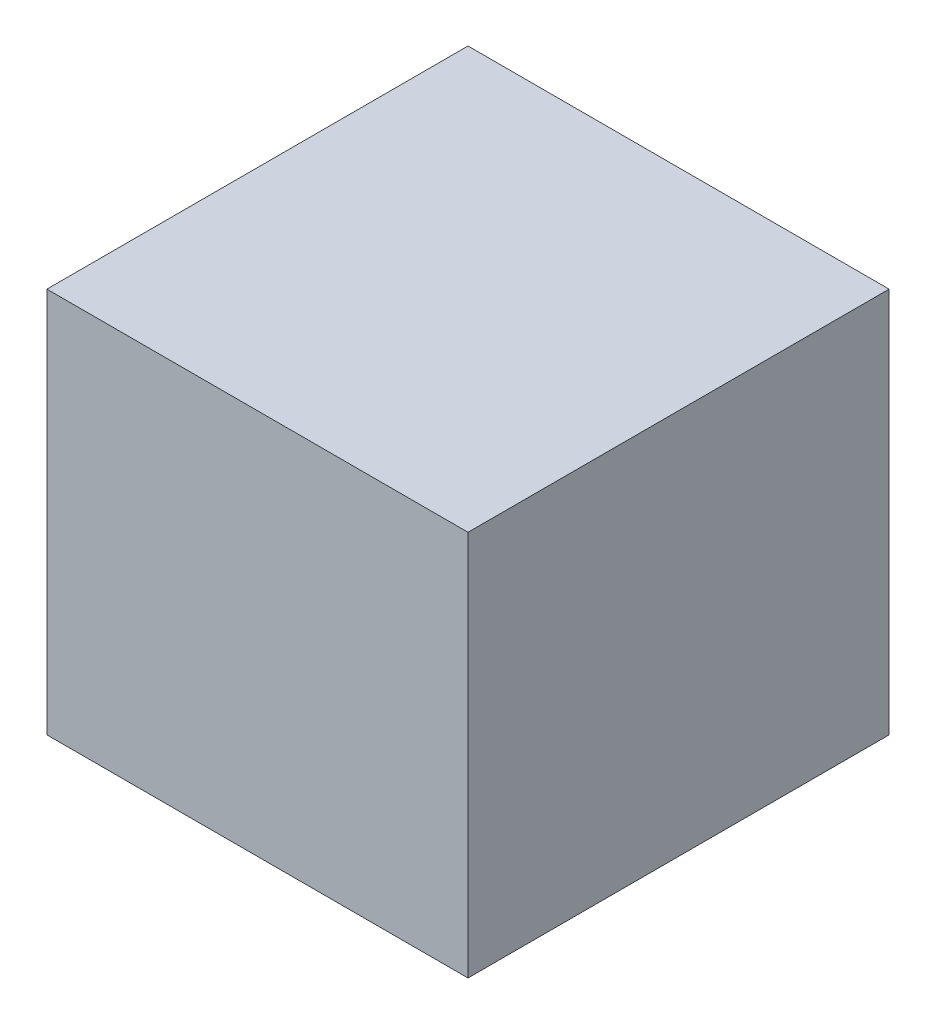
ISO-10303-21;
HEADER;
FILE_DESCRIPTION(('STEP AP214'),'2;1');
FILE_NAME('part.step','',(''),(''),'','','');
FILE_SCHEMA(('AUTOMOTIVE_DESIGN { 1 0 10303 214 1 1 1 1 }'));
ENDSEC;
DATA;
#1=APPLICATION_CONTEXT('core data for automotive mechanical design processes');
#2=APPLICATION_PROTOCOL_DEFINITION('international standard','automotive_design',2000,#1);
#3=PRODUCT_CONTEXT('',#1,'mechanical');
#4=PRODUCT('Part','Part','',(#3));
#5=PRODUCT_RELATED_PRODUCT_CATEGORY('part','',(#4));
#6=PRODUCT_DEFINITION_FORMATION('','',#4);
#7=PRODUCT_DEFINITION_CONTEXT('part definition',#1,'design');
#8=PRODUCT_DEFINITION('design','',#6,#7);
#9=PRODUCT_DEFINITION_SHAPE('','',#8);
#10=(LENGTH_UNIT() NAMED_UNIT(*) SI_UNIT(.MILLI.,.METRE.));
#11=(NAMED_UNIT(*) PLANE_ANGLE_UNIT() SI_UNIT($,.RADIAN.));
#12=(NAMED_UNIT(*) SI_UNIT($,.STERADIAN.) SOLID_ANGLE_UNIT());
#13=UNCERTAINTY_MEASURE_WITH_UNIT(LENGTH_MEASURE(1.E-05),#10,'distance_accuracy_value','');
#14=(GEOMETRIC_REPRESENTATION_CONTEXT(3) GLOBAL_UNCERTAINTY_ASSIGNED_CONTEXT((#13)) GLOBAL_UNIT_ASSIGNED_CONTEXT((#10,
#11,#12)) REPRESENTATION_CONTEXT('',''));
#15=CARTESIAN_POINT('',(0.,0.,0.));
#16=DIRECTION('',(0.,0.,1.));
#17=DIRECTION('',(1.,0.,0.));
#18=AXIS2_PLACEMENT_3D('',#15,#16,#17);
#19=CARTESIAN_POINT('',(0.,76.2,0.));
#20=DIRECTION('',(0.,1.,0.));
#21=DIRECTION('',(0.,0.,1.));
#22=AXIS2_PLACEMENT_3D('',#19,#20,#21);
#23=PLANE('',#22);
#24=CARTESIAN_POINT('',(0.,76.2,0.));
#25=DIRECTION('',(0.,1.,0.));
#26=DIRECTION('',(0.,0.,1.));
#27=AXIS2_PLACEMENT_3D('',#24,#25,#26);
#28=CIRCLE('',#27,10.16);
#29=CARTESIAN_POINT('',(0.,76.2,10.16));
#30=VERTEX_POINT('',#29);
#31=EDGE_CURVE('E176',#30,#30,#28,.T.);
#32=ORIENTED_EDGE('',*,*,#31,.F.);
#33=EDGE_LOOP('',(#32));
#34=FACE_BOUND('',#33,.T.);
#35=ADVANCED_FACE('F39',(#34),#23,.F.);
#36=CARTESIAN_POINT('',(13.208,83.82,0.));
#37=DIRECTION('',(0.,-1.,0.));
#38=DIRECTION('',(0.,0.,-1.));
#39=AXIS2_PLACEMENT_3D('',#36,#37,#38);
#40=PLANE('',#39);
#41=DIRECTION('',(0.,0.,-1.));
#42=VECTOR('',#41,1.);
#43=CARTESIAN_POINT('',(45.72,83.82,45.72));
#44=LINE('',#43,#42);
#45=CARTESIAN_POINT('',(45.72,83.82,45.72));
#46=VERTEX_POINT('',#45);
#47=CARTESIAN_POINT('',(45.72,83.82,-45.72));
#48=VERTEX_POINT('',#47);
#49=EDGE_CURVE('E47',#46,#48,#44,.T.);
#50=ORIENTED_EDGE('',*,*,#49,.T.);
#51=DIRECTION('',(-1.,0.,0.));
#52=VECTOR('',#51,1.);
#53=CARTESIAN_POINT('',(-45.72,83.82,-45.72));
#54=LINE('',#53,#52);
#55=CARTESIAN_POINT('',(-45.72,83.82,-45.72));
#56=VERTEX_POINT('',#55);
#57=EDGE_CURVE('E53',#48,#56,#54,.T.);
#58=ORIENTED_EDGE('',*,*,#57,.T.);
#59=DIRECTION('',(0.,0.,1.));
#60=VECTOR('',#59,1.);
#61=CARTESIAN_POINT('',(-45.72,83.82,45.72));
#62=LINE('',#61,#60);
#63=CARTESIAN_POINT('',(-45.72,83.8200000000001,45.72));
#64=VERTEX_POINT('',#63);
#65=EDGE_CURVE('E109',#56,#64,#62,.T.);
#66=ORIENTED_EDGE('',*,*,#65,.T.);
#67=DIRECTION('',(1.,0.,0.));
#68=VECTOR('',#67,1.);
#69=CARTESIAN_POINT('',(-45.72,83.82,45.72));
#70=LINE('',#69,#68);
#71=EDGE_CURVE('E11',#64,#46,#70,.T.);
#72=ORIENTED_EDGE('',*,*,#71,.T.);
#73=EDGE_LOOP('',(#50,#58,#66,#72));
#74=FACE_BOUND('',#73,.T.);
#75=ADVANCED_FACE('F187',(#74),#40,.F.);
#76=CARTESIAN_POINT('',(-45.72,220.755688143396,-45.72));
#77=DIRECTION('',(0.,0.,-1.));
#78=DIRECTION('',(-1.,0.,0.));
#79=AXIS2_PLACEMENT_3D('',#76,#77,#78);
#80=PLANE('',#79);
#81=ORIENTED_EDGE('',*,*,#57,.F.);
#82=DIRECTION('',(0.,-1.,0.));
#83=VECTOR('',#82,1.);
#84=CARTESIAN_POINT('',(45.72,220.755688143396,-45.72));
#85=LINE('',#84,#83);
#86=CARTESIAN_POINT('',(45.72,0.,-45.72));
#87=VERTEX_POINT('',#86);
#88=EDGE_CURVE('E107',#48,#87,#85,.T.);
#89=ORIENTED_EDGE('',*,*,#88,.T.);
#90=DIRECTION('',(1.,0.,0.));
#91=VECTOR('',#90,1.);
#92=CARTESIAN_POINT('',(-45.72,0.,-45.72));
#93=LINE('',#92,#91);
#94=CARTESIAN_POINT('',(-45.72,0.,-45.72));
#95=VERTEX_POINT('',#94);
#96=EDGE_CURVE('E85',#95,#87,#93,.T.);
#97=ORIENTED_EDGE('',*,*,#96,.F.);
#98=DIRECTION('',(0.,-1.,0.));
#99=VECTOR('',#98,1.);
#100=CARTESIAN_POINT('',(-45.72,220.755688143396,-45.72));
#101=LINE('',#100,#99);
#102=EDGE_CURVE('E110',#56,#95,#101,.T.);
#103=ORIENTED_EDGE('',*,*,#102,.F.);
#104=EDGE_LOOP('',(#81,#89,#97,#103));
#105=FACE_BOUND('',#104,.T.);
#106=ADVANCED_FACE('F116',(#105),#80,.T.);
#107=CARTESIAN_POINT('',(-45.72,220.755688143396,45.72));
#108=DIRECTION('',(-1.,0.,0.));
#109=DIRECTION('',(0.,0.,1.));
#110=AXIS2_PLACEMENT_3D('',#107,#108,#109);
#111=PLANE('',#110);
#112=ORIENTED_EDGE('',*,*,#65,.F.);
#113=ORIENTED_EDGE('',*,*,#102,.T.);
#114=DIRECTION('',(0.,0.,-1.));
#115=VECTOR('',#114,1.);
#116=CARTESIAN_POINT('',(-45.72,0.,45.72));
#117=LINE('',#116,#115);
#118=CARTESIAN_POINT('',(-45.72,0.,45.72));
#119=VERTEX_POINT('',#118);
#120=EDGE_CURVE('E93',#119,#95,#117,.T.);
#121=ORIENTED_EDGE('',*,*,#120,.F.);
#122=DIRECTION('',(0.,-1.,0.));
#123=VECTOR('',#122,1.);
#124=CARTESIAN_POINT('',(-45.72,220.755688143396,45.72));
#125=LINE('',#124,#123);
#126=EDGE_CURVE('E84',#64,#119,#125,.T.);
#127=ORIENTED_EDGE('',*,*,#126,.F.);
#128=EDGE_LOOP('',(#112,#113,#121,#127));
#129=FACE_BOUND('',#128,.T.);
#130=ADVANCED_FACE('F114',(#129),#111,.T.);
#131=CARTESIAN_POINT('',(-45.72,220.755688143396,45.72));
#132=DIRECTION('',(0.,0.,1.));
#133=DIRECTION('',(1.,0.,0.));
#134=AXIS2_PLACEMENT_3D('',#131,#132,#133);
#135=PLANE('',#134);
#136=ORIENTED_EDGE('',*,*,#71,.F.);
#137=ORIENTED_EDGE('',*,*,#126,.T.);
#138=DIRECTION('',(-1.,0.,0.));
#139=VECTOR('',#138,1.);
#140=CARTESIAN_POINT('',(-45.72,0.,45.72));
#141=LINE('',#140,#139);
#142=CARTESIAN_POINT('',(45.72,0.,45.72));
#143=VERTEX_POINT('',#142);
#144=EDGE_CURVE('E87',#143,#119,#141,.T.);
#145=ORIENTED_EDGE('',*,*,#144,.F.);
#146=DIRECTION('',(0.,-1.,0.));
#147=VECTOR('',#146,1.);
#148=CARTESIAN_POINT('',(45.72,220.755688143396,45.72));
#149=LINE('',#148,#147);
#150=EDGE_CURVE('E75',#46,#143,#149,.T.);
#151=ORIENTED_EDGE('',*,*,#150,.F.);
#152=EDGE_LOOP('',(#136,#137,#145,#151));
#153=FACE_BOUND('',#152,.T.);
#154=ADVANCED_FACE('F88',(#153),#135,.T.);
#155=CARTESIAN_POINT('',(45.72,220.755688143396,45.72));
#156=DIRECTION('',(1.,0.,0.));
#157=DIRECTION('',(0.,0.,-1.));
#158=AXIS2_PLACEMENT_3D('',#155,#156,#157);
#159=PLANE('',#158);
#160=ORIENTED_EDGE('',*,*,#49,.F.);
#161=ORIENTED_EDGE('',*,*,#150,.T.);
#162=DIRECTION('',(0.,0.,1.));
#163=VECTOR('',#162,1.);
#164=CARTESIAN_POINT('',(45.72,0.,45.72));
#165=LINE('',#164,#163);
#166=EDGE_CURVE('E80',#87,#143,#165,.T.);
#167=ORIENTED_EDGE('',*,*,#166,.F.);
#168=ORIENTED_EDGE('',*,*,#88,.F.);
#169=EDGE_LOOP('',(#160,#161,#167,#168));
#170=FACE_BOUND('',#169,.T.);
#171=ADVANCED_FACE('F77',(#170),#159,.T.);
#172=CARTESIAN_POINT('',(0.,0.,0.));
#173=DIRECTION('',(0.,-1.,0.));
#174=DIRECTION('',(0.,0.,-1.));
#175=AXIS2_PLACEMENT_3D('',#172,#173,#174);
#176=PLANE('',#175);
#177=CARTESIAN_POINT('',(0.,0.,0.));
#178=DIRECTION('',(0.,1.,0.));
#179=DIRECTION('',(0.,0.,1.));
#180=AXIS2_PLACEMENT_3D('',#177,#178,#179);
#181=CIRCLE('',#180,35.56);
#182=CARTESIAN_POINT('',(0.,0.,35.56));
#183=VERTEX_POINT('',#182);
#184=EDGE_CURVE('E145',#183,#183,#181,.F.);
#185=ORIENTED_EDGE('',*,*,#184,.F.);
#186=EDGE_LOOP('',(#185));
#187=FACE_BOUND('',#186,.T.);
#188=ORIENTED_EDGE('',*,*,#166,.T.);
#189=ORIENTED_EDGE('',*,*,#144,.T.);
#190=ORIENTED_EDGE('',*,*,#120,.T.);
#191=ORIENTED_EDGE('',*,*,#96,.T.);
#192=EDGE_LOOP('',(#188,#189,#190,#191));
#193=FACE_BOUND('',#192,.T.);
#194=ADVANCED_FACE('F95',(#187,#193),#176,.T.);
#195=CARTESIAN_POINT('',(0.,60.6579363383213,0.));
#196=DIRECTION('',(0.,1.,0.));
#197=DIRECTION('',(0.,0.,1.));
#198=AXIS2_PLACEMENT_3D('',#195,#196,#197);
#199=TOROIDAL_SURFACE('',#198,23.368,10.16);
#200=CARTESIAN_POINT('',(0.,60.6579363383213,0.));
#201=DIRECTION('',(0.,1.,0.));
#202=DIRECTION('',(0.,0.,1.));
#203=AXIS2_PLACEMENT_3D('',#200,#201,#202);
#204=CIRCLE('',#203,13.208);
#205=CARTESIAN_POINT('',(0.,60.6579363383213,13.208));
#206=VERTEX_POINT('',#205);
#207=EDGE_CURVE('E167',#206,#206,#204,.T.);
#208=ORIENTED_EDGE('',*,*,#207,.T.);
#209=EDGE_LOOP('',(#208));
#210=FACE_BOUND('',#209,.T.);
#211=CARTESIAN_POINT('',(0.,54.3893477857335,0.));
#212=DIRECTION('',(0.,1.,0.));
#213=DIRECTION('',(0.,0.,1.));
#214=AXIS2_PLACEMENT_3D('',#211,#212,#213);
#215=CIRCLE('',#214,15.372351335985);
#216=CARTESIAN_POINT('',(0.,54.3893477857335,15.372351335985));
#217=VERTEX_POINT('',#216);
#218=EDGE_CURVE('E164',#217,#217,#215,.T.);
#219=ORIENTED_EDGE('',*,*,#218,.F.);
#220=EDGE_LOOP('',(#219));
#221=FACE_BOUND('',#220,.T.);
#222=ADVANCED_FACE('F194',(#210,#221),#199,.T.);
#223=CARTESIAN_POINT('',(0.,76.2,0.));
#224=DIRECTION('',(0.,1.,0.));
#225=DIRECTION('',(0.,0.,1.));
#226=AXIS2_PLACEMENT_3D('',#223,#224,#225);
#227=CYLINDRICAL_SURFACE('',#226,13.208);
#228=CARTESIAN_POINT('',(0.,64.2062181691606,0.));
#229=DIRECTION('',(0.,-1.,0.));
#230=DIRECTION('',(0.,0.,-1.));
#231=AXIS2_PLACEMENT_3D('',#228,#229,#230);
#232=CIRCLE('',#231,13.208);
#233=CARTESIAN_POINT('',(0.,64.2062181691606,-13.208));
#234=VERTEX_POINT('',#233);
#235=EDGE_CURVE('E127',#234,#234,#232,.T.);
#236=ORIENTED_EDGE('',*,*,#235,.F.);
#237=EDGE_LOOP('',(#236));
#238=FACE_BOUND('',#237,.T.);
#239=ORIENTED_EDGE('',*,*,#207,.F.);
#240=EDGE_LOOP('',(#239));
#241=FACE_BOUND('',#240,.T.);
#242=ADVANCED_FACE('F201',(#238,#241),#227,.F.);
#243=CARTESIAN_POINT('',(0.,64.2062181691606,0.));
#244=DIRECTION('',(0.,-1.,0.));
#245=DIRECTION('',(0.,0.,-1.));
#246=AXIS2_PLACEMENT_3D('',#243,#244,#245);
#247=TOROIDAL_SURFACE('',#246,12.954,0.254);
#248=ORIENTED_EDGE('',*,*,#235,.T.);
#249=EDGE_LOOP('',(#248));
#250=FACE_BOUND('',#249,.T.);
#251=CARTESIAN_POINT('',(0.,64.4602181691606,0.));
#252=DIRECTION('',(0.,-1.,0.));
#253=DIRECTION('',(0.,0.,-1.));
#254=AXIS2_PLACEMENT_3D('',#251,#252,#253);
#255=CIRCLE('',#254,12.954);
#256=CARTESIAN_POINT('',(0.,64.4602181691606,-12.954));
#257=VERTEX_POINT('',#256);
#258=EDGE_CURVE('E130',#257,#257,#255,.F.);
#259=ORIENTED_EDGE('',*,*,#258,.T.);
#260=EDGE_LOOP('',(#259));
#261=FACE_BOUND('',#260,.T.);
#262=ADVANCED_FACE('F248',(#250,#261),#247,.F.);
#263=CARTESIAN_POINT('',(12.446,64.4602181691606,0.));
#264=DIRECTION('',(0.,-1.,0.));
#265=DIRECTION('',(0.,0.,-1.));
#266=AXIS2_PLACEMENT_3D('',#263,#264,#265);
#267=PLANE('',#266);
#268=ORIENTED_EDGE('',*,*,#258,.F.);
#269=EDGE_LOOP('',(#268));
#270=FACE_BOUND('',#269,.T.);
#271=CARTESIAN_POINT('',(0.,64.4602181691606,0.));
#272=DIRECTION('',(0.,1.,0.));
#273=DIRECTION('',(0.,0.,1.));
#274=AXIS2_PLACEMENT_3D('',#271,#272,#273);
#275=CIRCLE('',#274,12.446);
#276=CARTESIAN_POINT('',(0.,64.4602181691606,12.446));
#277=VERTEX_POINT('',#276);
#278=EDGE_CURVE('E170',#277,#277,#275,.T.);
#279=ORIENTED_EDGE('',*,*,#278,.T.);
#280=EDGE_LOOP('',(#279));
#281=FACE_BOUND('',#280,.T.);
#282=ADVANCED_FACE('F261',(#270,#281),#267,.T.);
#283=CARTESIAN_POINT('',(0.,76.2,0.));
#284=DIRECTION('',(0.,1.,0.));
#285=DIRECTION('',(0.,0.,1.));
#286=AXIS2_PLACEMENT_3D('',#283,#284,#285);
#287=CYLINDRICAL_SURFACE('',#286,12.446);
#288=CARTESIAN_POINT('',(0.,72.3977181691606,0.));
#289=DIRECTION('',(0.,1.,0.));
#290=DIRECTION('',(0.,0.,1.));
#291=AXIS2_PLACEMENT_3D('',#288,#289,#290);
#292=CIRCLE('',#291,12.446);
#293=CARTESIAN_POINT('',(0.,72.3977181691606,12.446));
#294=VERTEX_POINT('',#293);
#295=EDGE_CURVE('E173',#294,#294,#292,.T.);
#296=ORIENTED_EDGE('',*,*,#295,.T.);
#297=EDGE_LOOP('',(#296));
#298=FACE_BOUND('',#297,.T.);
#299=ORIENTED_EDGE('',*,*,#278,.F.);
#300=EDGE_LOOP('',(#299));
#301=FACE_BOUND('',#300,.T.);
#302=ADVANCED_FACE('F274',(#298,#301),#287,.F.);
#303=CARTESIAN_POINT('',(13.208,72.3977181691606,0.));
#304=DIRECTION('',(0.,1.,0.));
#305=DIRECTION('',(0.,0.,1.));
#306=AXIS2_PLACEMENT_3D('',#303,#304,#305);
#307=PLANE('',#306);
#308=CARTESIAN_POINT('',(0.,72.3977181691606,0.));
#309=DIRECTION('',(0.,1.,0.));
#310=DIRECTION('',(0.,0.,1.));
#311=AXIS2_PLACEMENT_3D('',#308,#309,#310);
#312=CIRCLE('',#311,12.954);
#313=CARTESIAN_POINT('',(0.,72.3977181691606,12.954));
#314=VERTEX_POINT('',#313);
#315=EDGE_CURVE('E133',#314,#314,#312,.F.);
#316=ORIENTED_EDGE('',*,*,#315,.F.);
#317=EDGE_LOOP('',(#316));
#318=FACE_BOUND('',#317,.T.);
#319=ORIENTED_EDGE('',*,*,#295,.F.);
#320=EDGE_LOOP('',(#319));
#321=FACE_BOUND('',#320,.T.);
#322=ADVANCED_FACE('F286',(#318,#321),#307,.T.);
#323=CARTESIAN_POINT('',(0.,72.6517181691606,0.));
#324=DIRECTION('',(0.,1.,0.));
#325=DIRECTION('',(0.,0.,1.));
#326=AXIS2_PLACEMENT_3D('',#323,#324,#325);
#327=TOROIDAL_SURFACE('',#326,12.954,0.254);
#328=ORIENTED_EDGE('',*,*,#315,.T.);
#329=EDGE_LOOP('',(#328));
#330=FACE_BOUND('',#329,.T.);
#331=CARTESIAN_POINT('',(0.,72.6517181691606,0.));
#332=DIRECTION('',(0.,1.,0.));
#333=DIRECTION('',(0.,0.,1.));
#334=AXIS2_PLACEMENT_3D('',#331,#332,#333);
#335=CIRCLE('',#334,13.208);
#336=CARTESIAN_POINT('',(0.,72.6517181691606,13.208));
#337=VERTEX_POINT('',#336);
#338=EDGE_CURVE('E136',#337,#337,#335,.T.);
#339=ORIENTED_EDGE('',*,*,#338,.T.);
#340=EDGE_LOOP('',(#339));
#341=FACE_BOUND('',#340,.T.);
#342=ADVANCED_FACE('F297',(#330,#341),#327,.F.);
#343=CARTESIAN_POINT('',(0.,76.2,0.));
#344=DIRECTION('',(0.,1.,0.));
#345=DIRECTION('',(0.,0.,1.));
#346=AXIS2_PLACEMENT_3D('',#343,#344,#345);
#347=CYLINDRICAL_SURFACE('',#346,13.208);
#348=ORIENTED_EDGE('',*,*,#338,.F.);
#349=EDGE_LOOP('',(#348));
#350=FACE_BOUND('',#349,.T.);
#351=CARTESIAN_POINT('',(0.,73.66,0.));
#352=DIRECTION('',(0.,-1.,0.));
#353=DIRECTION('',(0.,0.,-1.));
#354=AXIS2_PLACEMENT_3D('',#351,#352,#353);
#355=CIRCLE('',#354,13.208);
#356=CARTESIAN_POINT('',(0.,73.66,-13.208));
#357=VERTEX_POINT('',#356);
#358=EDGE_CURVE('E139',#357,#357,#355,.T.);
#359=ORIENTED_EDGE('',*,*,#358,.F.);
#360=EDGE_LOOP('',(#359));
#361=FACE_BOUND('',#360,.T.);
#362=ADVANCED_FACE('F307',(#350,#361),#347,.F.);
#363=CARTESIAN_POINT('',(0.,73.66,0.));
#364=DIRECTION('',(0.,-1.,0.));
#365=DIRECTION('',(0.,0.,-1.));
#366=AXIS2_PLACEMENT_3D('',#363,#364,#365);
#367=TOROIDAL_SURFACE('',#366,10.668,2.54);
#368=ORIENTED_EDGE('',*,*,#358,.T.);
#369=EDGE_LOOP('',(#368));
#370=FACE_BOUND('',#369,.T.);
#371=CARTESIAN_POINT('',(0.,76.2,0.));
#372=DIRECTION('',(0.,-1.,0.));
#373=DIRECTION('',(0.,0.,-1.));
#374=AXIS2_PLACEMENT_3D('',#371,#372,#373);
#375=CIRCLE('',#374,10.668);
#376=CARTESIAN_POINT('',(0.,76.2,-10.668));
#377=VERTEX_POINT('',#376);
#378=EDGE_CURVE('E142',#377,#377,#375,.F.);
#379=ORIENTED_EDGE('',*,*,#378,.T.);
#380=EDGE_LOOP('',(#379));
#381=FACE_BOUND('',#380,.T.);
#382=ADVANCED_FACE('F318',(#370,#381),#367,.F.);
#383=CARTESIAN_POINT('',(13.208,76.2,0.));
#384=DIRECTION('',(0.,-1.,0.));
#385=DIRECTION('',(0.,0.,-1.));
#386=AXIS2_PLACEMENT_3D('',#383,#384,#385);
#387=PLANE('',#386);
#388=ORIENTED_EDGE('',*,*,#378,.F.);
#389=EDGE_LOOP('',(#388));
#390=FACE_BOUND('',#389,.T.);
#391=ORIENTED_EDGE('',*,*,#31,.T.);
#392=EDGE_LOOP('',(#391));
#393=FACE_BOUND('',#392,.T.);
#394=ADVANCED_FACE('F184',(#390,#393),#387,.T.);
#395=CARTESIAN_POINT('',(0.,28.1606522142665,0.));
#396=DIRECTION('',(0.,-1.,0.));
#397=DIRECTION('',(0.,0.,-1.));
#398=AXIS2_PLACEMENT_3D('',#395,#396,#397);
#399=CONICAL_SURFACE('',#398,35.935648664015,0.664908417409286);
#400=ORIENTED_EDGE('',*,*,#218,.T.);
#401=EDGE_LOOP('',(#400));
#402=FACE_BOUND('',#401,.T.);
#403=CARTESIAN_POINT('',(0.,28.1606522142665,0.));
#404=DIRECTION('',(0.,1.,0.));
#405=DIRECTION('',(0.,0.,1.));
#406=AXIS2_PLACEMENT_3D('',#403,#404,#405);
#407=CIRCLE('',#406,35.935648664015);
#408=CARTESIAN_POINT('',(0.,28.1606522142665,35.935648664015));
#409=VERTEX_POINT('',#408);
#410=EDGE_CURVE('E161',#409,#409,#407,.T.);
#411=ORIENTED_EDGE('',*,*,#410,.F.);
#412=EDGE_LOOP('',(#411));
#413=FACE_BOUND('',#412,.T.);
#414=ADVANCED_FACE('F341',(#402,#413),#399,.F.);
#415=CARTESIAN_POINT('',(0.,21.8920636616788,0.));
#416=DIRECTION('',(0.,1.,0.));
#417=DIRECTION('',(0.,0.,1.));
#418=AXIS2_PLACEMENT_3D('',#415,#416,#417);
#419=TOROIDAL_SURFACE('',#418,27.94,10.16);
#420=ORIENTED_EDGE('',*,*,#410,.T.);
#421=EDGE_LOOP('',(#420));
#422=FACE_BOUND('',#421,.T.);
#423=CARTESIAN_POINT('',(0.,21.8920636616788,0.));
#424=DIRECTION('',(0.,1.,0.));
#425=DIRECTION('',(0.,0.,1.));
#426=AXIS2_PLACEMENT_3D('',#423,#424,#425);
#427=CIRCLE('',#426,38.1);
#428=CARTESIAN_POINT('',(0.,21.8920636616788,38.1));
#429=VERTEX_POINT('',#428);
#430=EDGE_CURVE('E158',#429,#429,#427,.T.);
#431=ORIENTED_EDGE('',*,*,#430,.F.);
#432=EDGE_LOOP('',(#431));
#433=FACE_BOUND('',#432,.T.);
#434=ADVANCED_FACE('F354',(#422,#433),#419,.F.);
#435=CARTESIAN_POINT('',(0.,76.2,0.));
#436=DIRECTION('',(0.,1.,0.));
#437=DIRECTION('',(0.,0.,1.));
#438=AXIS2_PLACEMENT_3D('',#435,#436,#437);
#439=CYLINDRICAL_SURFACE('',#438,38.1);
#440=CARTESIAN_POINT('',(0.,15.1687818308394,0.));
#441=DIRECTION('',(0.,1.,0.));
#442=DIRECTION('',(0.,0.,1.));
#443=AXIS2_PLACEMENT_3D('',#440,#441,#442);
#444=CIRCLE('',#443,38.1);
#445=CARTESIAN_POINT('',(0.,15.1687818308394,38.1));
#446=VERTEX_POINT('',#445);
#447=EDGE_CURVE('E124',#446,#446,#444,.T.);
#448=ORIENTED_EDGE('',*,*,#447,.F.);
#449=EDGE_LOOP('',(#448));
#450=FACE_BOUND('',#449,.T.);
#451=ORIENTED_EDGE('',*,*,#430,.T.);
#452=EDGE_LOOP('',(#451));
#453=FACE_BOUND('',#452,.T.);
#454=ADVANCED_FACE('F364',(#450,#453),#439,.F.);
#455=CARTESIAN_POINT('',(0.,15.1687818308394,0.));
#456=DIRECTION('',(0.,1.,0.));
#457=DIRECTION('',(0.,0.,1.));
#458=AXIS2_PLACEMENT_3D('',#455,#456,#457);
#459=TOROIDAL_SURFACE('',#458,37.846,0.254);
#460=CARTESIAN_POINT('',(0.,14.9147818308394,0.));
#461=DIRECTION('',(0.,1.,0.));
#462=DIRECTION('',(0.,0.,1.));
#463=AXIS2_PLACEMENT_3D('',#460,#461,#462);
#464=CIRCLE('',#463,37.846);
#465=CARTESIAN_POINT('',(0.,14.9147818308394,37.846));
#466=VERTEX_POINT('',#465);
#467=EDGE_CURVE('E121',#466,#466,#464,.F.);
#468=ORIENTED_EDGE('',*,*,#467,.T.);
#469=EDGE_LOOP('',(#468));
#470=FACE_BOUND('',#469,.T.);
#471=ORIENTED_EDGE('',*,*,#447,.T.);
#472=EDGE_LOOP('',(#471));
#473=FACE_BOUND('',#472,.T.);
#474=ADVANCED_FACE('F374',(#470,#473),#459,.F.);
#475=CARTESIAN_POINT('',(38.1,14.9147818308394,0.));
#476=DIRECTION('',(0.,1.,0.));
#477=DIRECTION('',(0.,0.,1.));
#478=AXIS2_PLACEMENT_3D('',#475,#476,#477);
#479=PLANE('',#478);
#480=ORIENTED_EDGE('',*,*,#467,.F.);
#481=EDGE_LOOP('',(#480));
#482=FACE_BOUND('',#481,.T.);
#483=CARTESIAN_POINT('',(0.,14.9147818308394,0.));
#484=DIRECTION('',(0.,1.,0.));
#485=DIRECTION('',(0.,0.,1.));
#486=AXIS2_PLACEMENT_3D('',#483,#484,#485);
#487=CIRCLE('',#486,37.338);
#488=CARTESIAN_POINT('',(0.,14.9147818308394,37.338));
#489=VERTEX_POINT('',#488);
#490=EDGE_CURVE('E155',#489,#489,#487,.T.);
#491=ORIENTED_EDGE('',*,*,#490,.F.);
#492=EDGE_LOOP('',(#491));
#493=FACE_BOUND('',#492,.T.);
#494=ADVANCED_FACE('F385',(#482,#493),#479,.T.);
#495=CARTESIAN_POINT('',(0.,76.2,0.));
#496=DIRECTION('',(0.,1.,0.));
#497=DIRECTION('',(0.,0.,1.));
#498=AXIS2_PLACEMENT_3D('',#495,#496,#497);
#499=CYLINDRICAL_SURFACE('',#498,37.338);
#500=ORIENTED_EDGE('',*,*,#490,.T.);
#501=EDGE_LOOP('',(#500));
#502=FACE_BOUND('',#501,.T.);
#503=CARTESIAN_POINT('',(0.,6.97728183083939,0.));
#504=DIRECTION('',(0.,1.,0.));
#505=DIRECTION('',(0.,0.,1.));
#506=AXIS2_PLACEMENT_3D('',#503,#504,#505);
#507=CIRCLE('',#506,37.338);
#508=CARTESIAN_POINT('',(0.,6.97728183083939,37.338));
#509=VERTEX_POINT('',#508);
#510=EDGE_CURVE('E152',#509,#509,#507,.T.);
#511=ORIENTED_EDGE('',*,*,#510,.F.);
#512=EDGE_LOOP('',(#511));
#513=FACE_BOUND('',#512,.T.);
#514=ADVANCED_FACE('F395',(#502,#513),#499,.F.);
#515=CARTESIAN_POINT('',(37.338,6.97728183083938,0.));
#516=DIRECTION('',(0.,-1.,0.));
#517=DIRECTION('',(0.,0.,-1.));
#518=AXIS2_PLACEMENT_3D('',#515,#516,#517);
#519=PLANE('',#518);
#520=CARTESIAN_POINT('',(0.,6.97728183083938,0.));
#521=DIRECTION('',(0.,-1.,0.));
#522=DIRECTION('',(0.,0.,-1.));
#523=AXIS2_PLACEMENT_3D('',#520,#521,#522);
#524=CIRCLE('',#523,37.846);
#525=CARTESIAN_POINT('',(0.,6.97728183083938,-37.846));
#526=VERTEX_POINT('',#525);
#527=EDGE_CURVE('E100',#526,#526,#524,.F.);
#528=ORIENTED_EDGE('',*,*,#527,.F.);
#529=EDGE_LOOP('',(#528));
#530=FACE_BOUND('',#529,.T.);
#531=ORIENTED_EDGE('',*,*,#510,.T.);
#532=EDGE_LOOP('',(#531));
#533=FACE_BOUND('',#532,.T.);
#534=ADVANCED_FACE('F406',(#530,#533),#519,.T.);
#535=CARTESIAN_POINT('',(0.,6.72328183083938,0.));
#536=DIRECTION('',(0.,-1.,0.));
#537=DIRECTION('',(0.,0.,-1.));
#538=AXIS2_PLACEMENT_3D('',#535,#536,#537);
#539=TOROIDAL_SURFACE('',#538,37.846,0.254);
#540=CARTESIAN_POINT('',(0.,6.72328183083938,0.));
#541=DIRECTION('',(0.,-1.,0.));
#542=DIRECTION('',(0.,0.,-1.));
#543=AXIS2_PLACEMENT_3D('',#540,#541,#542);
#544=CIRCLE('',#543,38.1);
#545=CARTESIAN_POINT('',(0.,6.72328183083938,-38.1));
#546=VERTEX_POINT('',#545);
#547=EDGE_CURVE('E97',#546,#546,#544,.T.);
#548=ORIENTED_EDGE('',*,*,#547,.T.);
#549=EDGE_LOOP('',(#548));
#550=FACE_BOUND('',#549,.T.);
#551=ORIENTED_EDGE('',*,*,#527,.T.);
#552=EDGE_LOOP('',(#551));
#553=FACE_BOUND('',#552,.T.);
#554=ADVANCED_FACE('F417',(#550,#553),#539,.F.);
#555=CARTESIAN_POINT('',(0.,76.2,0.));
#556=DIRECTION('',(0.,1.,0.));
#557=DIRECTION('',(0.,0.,1.));
#558=AXIS2_PLACEMENT_3D('',#555,#556,#557);
#559=CYLINDRICAL_SURFACE('',#558,38.1);
#560=ORIENTED_EDGE('',*,*,#547,.F.);
#561=EDGE_LOOP('',(#560));
#562=FACE_BOUND('',#561,.T.);
#563=CARTESIAN_POINT('',(0.,2.54,0.));
#564=DIRECTION('',(0.,1.,0.));
#565=DIRECTION('',(0.,0.,1.));
#566=AXIS2_PLACEMENT_3D('',#563,#564,#565);
#567=CIRCLE('',#566,38.1);
#568=CARTESIAN_POINT('',(0.,2.54,38.1));
#569=VERTEX_POINT('',#568);
#570=EDGE_CURVE('E149',#569,#569,#567,.T.);
#571=ORIENTED_EDGE('',*,*,#570,.F.);
#572=EDGE_LOOP('',(#571));
#573=FACE_BOUND('',#572,.T.);
#574=ADVANCED_FACE('F427',(#562,#573),#559,.F.);
#575=CARTESIAN_POINT('',(0.,2.54,0.));
#576=DIRECTION('',(0.,1.,0.));
#577=DIRECTION('',(0.,0.,1.));
#578=AXIS2_PLACEMENT_3D('',#575,#576,#577);
#579=TOROIDAL_SURFACE('',#578,35.56,2.54);
#580=ORIENTED_EDGE('',*,*,#184,.T.);
#581=EDGE_LOOP('',(#580));
#582=FACE_BOUND('',#581,.T.);
#583=ORIENTED_EDGE('',*,*,#570,.T.);
#584=EDGE_LOOP('',(#583));
#585=FACE_BOUND('',#584,.T.);
#586=ADVANCED_FACE('F192',(#582,#585),#579,.F.);
#587=CLOSED_SHELL('',(#35,#75,#106,#130,#154,#171,#194,#222,#242,#262,#282,#302,#322,#342,#362,
#382,#394,#414,#434,#454,#474,#494,#514,#534,#554,#574,#586));
#588=MANIFOLD_SOLID_BREP('B2',#587);
#589=ADVANCED_BREP_SHAPE_REPRESENTATION('',(#18,#588),#14);
#590=SHAPE_DEFINITION_REPRESENTATION(#9,#589);
ENDSEC;
END-ISO-10303-21;
